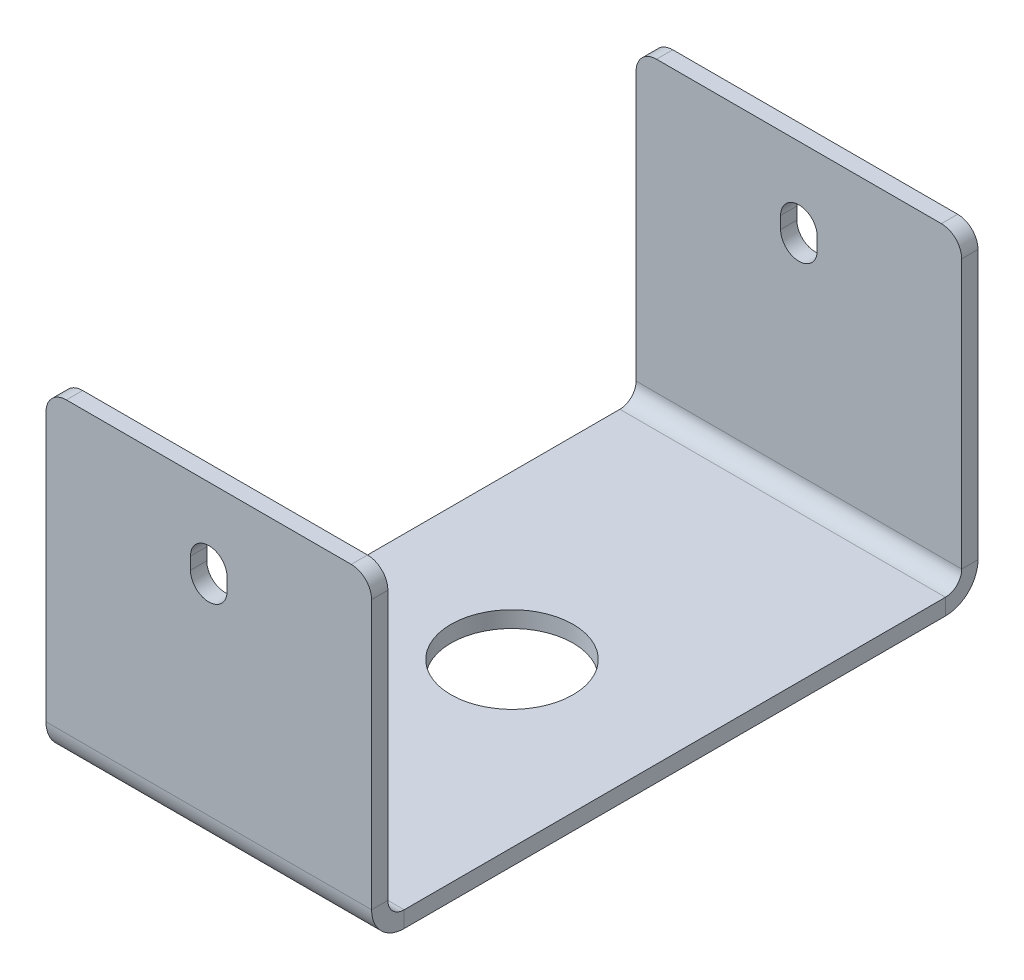
ISO-10303-21;
HEADER;
FILE_DESCRIPTION(('STEP AP214'),'2;1');
FILE_NAME('part.step','',(''),(''),'','','');
FILE_SCHEMA(('AUTOMOTIVE_DESIGN { 1 0 10303 214 1 1 1 1 }'));
ENDSEC;
DATA;
#1=APPLICATION_CONTEXT('core data for automotive mechanical design processes');
#2=APPLICATION_PROTOCOL_DEFINITION('international standard','automotive_design',2000,#1);
#3=PRODUCT_CONTEXT('',#1,'mechanical');
#4=PRODUCT('Part','Part','',(#3));
#5=PRODUCT_RELATED_PRODUCT_CATEGORY('part','',(#4));
#6=PRODUCT_DEFINITION_FORMATION('','',#4);
#7=PRODUCT_DEFINITION_CONTEXT('part definition',#1,'design');
#8=PRODUCT_DEFINITION('design','',#6,#7);
#9=PRODUCT_DEFINITION_SHAPE('','',#8);
#10=(LENGTH_UNIT() NAMED_UNIT(*) SI_UNIT(.MILLI.,.METRE.));
#11=(NAMED_UNIT(*) PLANE_ANGLE_UNIT() SI_UNIT($,.RADIAN.));
#12=(NAMED_UNIT(*) SI_UNIT($,.STERADIAN.) SOLID_ANGLE_UNIT());
#13=UNCERTAINTY_MEASURE_WITH_UNIT(LENGTH_MEASURE(1.E-05),#10,'distance_accuracy_value','');
#14=(GEOMETRIC_REPRESENTATION_CONTEXT(3) GLOBAL_UNCERTAINTY_ASSIGNED_CONTEXT((#13)) GLOBAL_UNIT_ASSIGNED_CONTEXT((#10,
#11,#12)) REPRESENTATION_CONTEXT('',''));
#15=CARTESIAN_POINT('',(0.,0.,0.));
#16=DIRECTION('',(0.,0.,1.));
#17=DIRECTION('',(1.,0.,0.));
#18=AXIS2_PLACEMENT_3D('',#15,#16,#17);
#19=CARTESIAN_POINT('',(40.,0.,66.5));
#20=DIRECTION('',(1.,0.,0.));
#21=DIRECTION('',(0.,0.,-1.));
#22=AXIS2_PLACEMENT_3D('',#19,#20,#21);
#23=PLANE('',#22);
#24=DIRECTION('',(0.,-1.,0.));
#25=VECTOR('',#24,1.);
#26=CARTESIAN_POINT('',(40.,0.,66.5));
#27=LINE('',#26,#25);
#28=CARTESIAN_POINT('',(40.,0.,66.5));
#29=VERTEX_POINT('',#28);
#30=CARTESIAN_POINT('',(40.,-4.,66.5));
#31=VERTEX_POINT('',#30);
#32=EDGE_CURVE('E382',#29,#31,#27,.T.);
#33=ORIENTED_EDGE('',*,*,#32,.F.);
#34=CARTESIAN_POINT('',(40.,4.,66.5));
#35=DIRECTION('',(-1.,0.,0.));
#36=DIRECTION('',(0.,0.,1.));
#37=AXIS2_PLACEMENT_3D('',#34,#35,#36);
#38=CIRCLE('',#37,4.);
#39=CARTESIAN_POINT('',(40.,4.,70.5));
#40=VERTEX_POINT('',#39);
#41=EDGE_CURVE('E289',#40,#29,#38,.F.);
#42=ORIENTED_EDGE('',*,*,#41,.F.);
#43=DIRECTION('',(0.,0.,-1.));
#44=VECTOR('',#43,1.);
#45=CARTESIAN_POINT('',(40.,4.00000000000001,74.5));
#46=LINE('',#45,#44);
#47=CARTESIAN_POINT('',(40.,4.00000000000001,74.5));
#48=VERTEX_POINT('',#47);
#49=EDGE_CURVE('E379',#48,#40,#46,.T.);
#50=ORIENTED_EDGE('',*,*,#49,.F.);
#51=CARTESIAN_POINT('',(40.,4.,66.5));
#52=DIRECTION('',(1.,0.,0.));
#53=DIRECTION('',(0.,0.,-1.));
#54=AXIS2_PLACEMENT_3D('',#51,#52,#53);
#55=CIRCLE('',#54,8.);
#56=EDGE_CURVE('E296',#48,#31,#55,.T.);
#57=ORIENTED_EDGE('',*,*,#56,.T.);
#58=EDGE_LOOP('',(#33,#42,#50,#57));
#59=FACE_BOUND('',#58,.T.);
#60=ADVANCED_FACE('F39',(#59),#23,.T.);
#61=CARTESIAN_POINT('',(40.,4.00000000000001,74.5));
#62=DIRECTION('',(1.,0.,0.));
#63=DIRECTION('',(0.,0.,-1.));
#64=AXIS2_PLACEMENT_3D('',#61,#62,#63);
#65=PLANE('',#64);
#66=DIRECTION('',(0.,0.,-1.));
#67=VECTOR('',#66,1.);
#68=CARTESIAN_POINT('',(40.,0.,70.5));
#69=LINE('',#68,#67);
#70=CARTESIAN_POINT('',(40.,0.,-66.5));
#71=VERTEX_POINT('',#70);
#72=EDGE_CURVE('E286',#29,#71,#69,.T.);
#73=ORIENTED_EDGE('',*,*,#72,.F.);
#74=ORIENTED_EDGE('',*,*,#32,.T.);
#75=DIRECTION('',(0.,0.,-1.));
#76=VECTOR('',#75,1.);
#77=CARTESIAN_POINT('',(40.,-4.,70.5));
#78=LINE('',#77,#76);
#79=CARTESIAN_POINT('',(40.,-4.,-66.5));
#80=VERTEX_POINT('',#79);
#81=EDGE_CURVE('E299',#31,#80,#78,.T.);
#82=ORIENTED_EDGE('',*,*,#81,.T.);
#83=DIRECTION('',(0.,1.,0.));
#84=VECTOR('',#83,1.);
#85=CARTESIAN_POINT('',(40.,-4.,-66.5));
#86=LINE('',#85,#84);
#87=EDGE_CURVE('E370',#80,#71,#86,.T.);
#88=ORIENTED_EDGE('',*,*,#87,.T.);
#89=EDGE_LOOP('',(#73,#74,#82,#88));
#90=FACE_BOUND('',#89,.T.);
#91=ADVANCED_FACE('F442',(#90),#65,.T.);
#92=CARTESIAN_POINT('',(-40.,4.,70.5));
#93=DIRECTION('',(-1.,0.,0.));
#94=DIRECTION('',(0.,0.,1.));
#95=AXIS2_PLACEMENT_3D('',#92,#93,#94);
#96=PLANE('',#95);
#97=DIRECTION('',(0.,0.,1.));
#98=VECTOR('',#97,1.);
#99=CARTESIAN_POINT('',(-40.,4.,70.5));
#100=LINE('',#99,#98);
#101=CARTESIAN_POINT('',(-40.,4.,70.5));
#102=VERTEX_POINT('',#101);
#103=CARTESIAN_POINT('',(-40.,4.00000000000001,74.5));
#104=VERTEX_POINT('',#103);
#105=EDGE_CURVE('E376',#102,#104,#100,.T.);
#106=ORIENTED_EDGE('',*,*,#105,.F.);
#107=CARTESIAN_POINT('',(-40.,4.,66.5));
#108=DIRECTION('',(-1.,0.,0.));
#109=DIRECTION('',(0.,0.,1.));
#110=AXIS2_PLACEMENT_3D('',#107,#108,#109);
#111=CIRCLE('',#110,4.);
#112=CARTESIAN_POINT('',(-40.,0.,66.5));
#113=VERTEX_POINT('',#112);
#114=EDGE_CURVE('E317',#102,#113,#111,.F.);
#115=ORIENTED_EDGE('',*,*,#114,.T.);
#116=DIRECTION('',(0.,1.,0.));
#117=VECTOR('',#116,1.);
#118=CARTESIAN_POINT('',(-40.,-4.,66.5));
#119=LINE('',#118,#117);
#120=CARTESIAN_POINT('',(-40.,-4.,66.5));
#121=VERTEX_POINT('',#120);
#122=EDGE_CURVE('E374',#121,#113,#119,.T.);
#123=ORIENTED_EDGE('',*,*,#122,.F.);
#124=CARTESIAN_POINT('',(-40.,4.,66.5));
#125=DIRECTION('',(1.,0.,0.));
#126=DIRECTION('',(0.,0.,-1.));
#127=AXIS2_PLACEMENT_3D('',#124,#125,#126);
#128=CIRCLE('',#127,8.);
#129=EDGE_CURVE('E324',#104,#121,#128,.T.);
#130=ORIENTED_EDGE('',*,*,#129,.F.);
#131=EDGE_LOOP('',(#106,#115,#123,#130));
#132=FACE_BOUND('',#131,.T.);
#133=ADVANCED_FACE('F499',(#132),#96,.T.);
#134=CARTESIAN_POINT('',(-40.,-4.,66.5));
#135=DIRECTION('',(-1.,0.,0.));
#136=DIRECTION('',(0.,0.,1.));
#137=AXIS2_PLACEMENT_3D('',#134,#135,#136);
#138=PLANE('',#137);
#139=DIRECTION('',(0.,-1.,0.));
#140=VECTOR('',#139,1.);
#141=CARTESIAN_POINT('',(-40.,75.,74.5));
#142=LINE('',#141,#140);
#143=CARTESIAN_POINT('',(-40.,70.,74.5));
#144=VERTEX_POINT('',#143);
#145=EDGE_CURVE('E322',#144,#104,#142,.T.);
#146=ORIENTED_EDGE('',*,*,#145,.F.);
#147=DIRECTION('',(0.,0.,-1.));
#148=VECTOR('',#147,1.);
#149=CARTESIAN_POINT('',(-40.,70.,66.5));
#150=LINE('',#149,#148);
#151=CARTESIAN_POINT('',(-40.,70.,70.5));
#152=VERTEX_POINT('',#151);
#153=EDGE_CURVE('E11',#144,#152,#150,.T.);
#154=ORIENTED_EDGE('',*,*,#153,.T.);
#155=DIRECTION('',(0.,-1.,0.));
#156=VECTOR('',#155,1.);
#157=CARTESIAN_POINT('',(-40.,75.,70.5));
#158=LINE('',#157,#156);
#159=EDGE_CURVE('E320',#152,#102,#158,.T.);
#160=ORIENTED_EDGE('',*,*,#159,.T.);
#161=ORIENTED_EDGE('',*,*,#105,.T.);
#162=EDGE_LOOP('',(#146,#154,#160,#161));
#163=FACE_BOUND('',#162,.T.);
#164=ADVANCED_FACE('F515',(#163),#138,.T.);
#165=CARTESIAN_POINT('',(40.,4.,-70.5));
#166=DIRECTION('',(1.,0.,0.));
#167=DIRECTION('',(0.,0.,-1.));
#168=AXIS2_PLACEMENT_3D('',#165,#166,#167);
#169=PLANE('',#168);
#170=DIRECTION('',(0.,0.,-1.));
#171=VECTOR('',#170,1.);
#172=CARTESIAN_POINT('',(40.,4.,-70.5));
#173=LINE('',#172,#171);
#174=CARTESIAN_POINT('',(40.,4.,-70.5));
#175=VERTEX_POINT('',#174);
#176=CARTESIAN_POINT('',(40.,4.,-74.5));
#177=VERTEX_POINT('',#176);
#178=EDGE_CURVE('E372',#175,#177,#173,.T.);
#179=ORIENTED_EDGE('',*,*,#178,.F.);
#180=CARTESIAN_POINT('',(40.,4.,-66.5));
#181=DIRECTION('',(-1.,0.,0.));
#182=DIRECTION('',(0.,0.,1.));
#183=AXIS2_PLACEMENT_3D('',#180,#181,#182);
#184=CIRCLE('',#183,4.);
#185=EDGE_CURVE('E283',#71,#175,#184,.F.);
#186=ORIENTED_EDGE('',*,*,#185,.F.);
#187=ORIENTED_EDGE('',*,*,#87,.F.);
#188=CARTESIAN_POINT('',(40.,4.,-66.5));
#189=DIRECTION('',(1.,0.,0.));
#190=DIRECTION('',(0.,0.,-1.));
#191=AXIS2_PLACEMENT_3D('',#188,#189,#190);
#192=CIRCLE('',#191,8.);
#193=EDGE_CURVE('E302',#80,#177,#192,.T.);
#194=ORIENTED_EDGE('',*,*,#193,.T.);
#195=EDGE_LOOP('',(#179,#186,#187,#194));
#196=FACE_BOUND('',#195,.T.);
#197=ADVANCED_FACE('F451',(#196),#169,.T.);
#198=CARTESIAN_POINT('',(40.,-4.,-66.5));
#199=DIRECTION('',(1.,0.,0.));
#200=DIRECTION('',(0.,0.,-1.));
#201=AXIS2_PLACEMENT_3D('',#198,#199,#200);
#202=PLANE('',#201);
#203=DIRECTION('',(0.,1.,0.));
#204=VECTOR('',#203,1.);
#205=CARTESIAN_POINT('',(40.,0.,-74.5));
#206=LINE('',#205,#204);
#207=CARTESIAN_POINT('',(40.,70.,-74.5));
#208=VERTEX_POINT('',#207);
#209=EDGE_CURVE('E276',#177,#208,#206,.T.);
#210=ORIENTED_EDGE('',*,*,#209,.T.);
#211=DIRECTION('',(0.,0.,-1.));
#212=VECTOR('',#211,1.);
#213=CARTESIAN_POINT('',(40.,70.,-66.5));
#214=LINE('',#213,#212);
#215=CARTESIAN_POINT('',(40.,70.,-70.5));
#216=VERTEX_POINT('',#215);
#217=EDGE_CURVE('E400',#208,#216,#214,.F.);
#218=ORIENTED_EDGE('',*,*,#217,.T.);
#219=DIRECTION('',(0.,1.,0.));
#220=VECTOR('',#219,1.);
#221=CARTESIAN_POINT('',(40.,0.,-70.5));
#222=LINE('',#221,#220);
#223=EDGE_CURVE('E279',#175,#216,#222,.T.);
#224=ORIENTED_EDGE('',*,*,#223,.F.);
#225=ORIENTED_EDGE('',*,*,#178,.T.);
#226=EDGE_LOOP('',(#210,#218,#224,#225));
#227=FACE_BOUND('',#226,.T.);
#228=ADVANCED_FACE('F461',(#227),#202,.T.);
#229=CARTESIAN_POINT('',(-40.,0.,-66.5));
#230=DIRECTION('',(-1.,0.,0.));
#231=DIRECTION('',(0.,0.,1.));
#232=AXIS2_PLACEMENT_3D('',#229,#230,#231);
#233=PLANE('',#232);
#234=DIRECTION('',(0.,-1.,0.));
#235=VECTOR('',#234,1.);
#236=CARTESIAN_POINT('',(-40.,0.,-66.5));
#237=LINE('',#236,#235);
#238=CARTESIAN_POINT('',(-40.,0.,-66.5));
#239=VERTEX_POINT('',#238);
#240=CARTESIAN_POINT('',(-40.,-4.,-66.5));
#241=VERTEX_POINT('',#240);
#242=EDGE_CURVE('E368',#239,#241,#237,.T.);
#243=ORIENTED_EDGE('',*,*,#242,.F.);
#244=CARTESIAN_POINT('',(-40.,4.,-66.5));
#245=DIRECTION('',(-1.,0.,0.));
#246=DIRECTION('',(0.,0.,1.));
#247=AXIS2_PLACEMENT_3D('',#244,#245,#246);
#248=CIRCLE('',#247,4.);
#249=CARTESIAN_POINT('',(-40.,4.,-70.5));
#250=VERTEX_POINT('',#249);
#251=EDGE_CURVE('E311',#239,#250,#248,.F.);
#252=ORIENTED_EDGE('',*,*,#251,.T.);
#253=DIRECTION('',(0.,0.,1.));
#254=VECTOR('',#253,1.);
#255=CARTESIAN_POINT('',(-40.,4.,-74.5));
#256=LINE('',#255,#254);
#257=CARTESIAN_POINT('',(-40.,4.,-74.5));
#258=VERTEX_POINT('',#257);
#259=EDGE_CURVE('E366',#258,#250,#256,.T.);
#260=ORIENTED_EDGE('',*,*,#259,.F.);
#261=CARTESIAN_POINT('',(-40.,4.,-66.5));
#262=DIRECTION('',(1.,0.,0.));
#263=DIRECTION('',(0.,0.,-1.));
#264=AXIS2_PLACEMENT_3D('',#261,#262,#263);
#265=CIRCLE('',#264,8.);
#266=EDGE_CURVE('E280',#241,#258,#265,.T.);
#267=ORIENTED_EDGE('',*,*,#266,.F.);
#268=EDGE_LOOP('',(#243,#252,#260,#267));
#269=FACE_BOUND('',#268,.T.);
#270=ADVANCED_FACE('F481',(#269),#233,.T.);
#271=CARTESIAN_POINT('',(-40.,4.,-74.5));
#272=DIRECTION('',(-1.,0.,0.));
#273=DIRECTION('',(0.,0.,1.));
#274=AXIS2_PLACEMENT_3D('',#271,#272,#273);
#275=PLANE('',#274);
#276=DIRECTION('',(0.,0.,-1.));
#277=VECTOR('',#276,1.);
#278=CARTESIAN_POINT('',(-40.,0.,70.5));
#279=LINE('',#278,#277);
#280=EDGE_CURVE('E314',#113,#239,#279,.T.);
#281=ORIENTED_EDGE('',*,*,#280,.T.);
#282=ORIENTED_EDGE('',*,*,#242,.T.);
#283=DIRECTION('',(0.,0.,-1.));
#284=VECTOR('',#283,1.);
#285=CARTESIAN_POINT('',(-40.,-4.,70.5));
#286=LINE('',#285,#284);
#287=EDGE_CURVE('E327',#121,#241,#286,.T.);
#288=ORIENTED_EDGE('',*,*,#287,.F.);
#289=ORIENTED_EDGE('',*,*,#122,.T.);
#290=EDGE_LOOP('',(#281,#282,#288,#289));
#291=FACE_BOUND('',#290,.T.);
#292=ADVANCED_FACE('F485',(#291),#275,.T.);
#293=CARTESIAN_POINT('',(40.,0.,-74.5));
#294=DIRECTION('',(0.,0.,1.));
#295=DIRECTION('',(0.,-1.,0.));
#296=AXIS2_PLACEMENT_3D('',#293,#294,#295);
#297=PLANE('',#296);
#298=DIRECTION('',(0.,1.,0.));
#299=VECTOR('',#298,1.);
#300=CARTESIAN_POINT('',(4.5,57.,-74.5));
#301=LINE('',#300,#299);
#302=CARTESIAN_POINT('',(4.5,54.,-74.5));
#303=VERTEX_POINT('',#302);
#304=CARTESIAN_POINT('',(4.5,57.,-74.5));
#305=VERTEX_POINT('',#304);
#306=EDGE_CURVE('E229',#303,#305,#301,.T.);
#307=ORIENTED_EDGE('',*,*,#306,.T.);
#308=CARTESIAN_POINT('',(0.,57.,-74.5));
#309=DIRECTION('',(0.,0.,1.));
#310=DIRECTION('',(1.,0.,0.));
#311=AXIS2_PLACEMENT_3D('',#308,#309,#310);
#312=CIRCLE('',#311,4.5);
#313=CARTESIAN_POINT('',(-4.5,57.,-74.5));
#314=VERTEX_POINT('',#313);
#315=EDGE_CURVE('E207',#305,#314,#312,.T.);
#316=ORIENTED_EDGE('',*,*,#315,.T.);
#317=DIRECTION('',(0.,-1.,0.));
#318=VECTOR('',#317,1.);
#319=CARTESIAN_POINT('',(-4.5,57.,-74.5));
#320=LINE('',#319,#318);
#321=CARTESIAN_POINT('',(-4.5,54.,-74.5));
#322=VERTEX_POINT('',#321);
#323=EDGE_CURVE('E218',#314,#322,#320,.T.);
#324=ORIENTED_EDGE('',*,*,#323,.T.);
#325=CARTESIAN_POINT('',(0.,54.,-74.5));
#326=DIRECTION('',(0.,0.,1.));
#327=DIRECTION('',(1.,0.,0.));
#328=AXIS2_PLACEMENT_3D('',#325,#326,#327);
#329=CIRCLE('',#328,4.5);
#330=EDGE_CURVE('E224',#322,#303,#329,.T.);
#331=ORIENTED_EDGE('',*,*,#330,.T.);
#332=EDGE_LOOP('',(#307,#316,#324,#331));
#333=FACE_BOUND('',#332,.T.);
#334=DIRECTION('',(0.,1.,0.));
#335=VECTOR('',#334,1.);
#336=CARTESIAN_POINT('',(-40.,0.,-74.5));
#337=LINE('',#336,#335);
#338=CARTESIAN_POINT('',(-40.,70.,-74.5));
#339=VERTEX_POINT('',#338);
#340=EDGE_CURVE('E273',#258,#339,#337,.T.);
#341=ORIENTED_EDGE('',*,*,#340,.T.);
#342=CARTESIAN_POINT('',(-35.,70.,-74.5));
#343=DIRECTION('',(0.,0.,1.));
#344=DIRECTION('',(0.,-1.,0.));
#345=AXIS2_PLACEMENT_3D('',#342,#343,#344);
#346=CIRCLE('',#345,5.);
#347=CARTESIAN_POINT('',(-35.,75.,-74.5));
#348=VERTEX_POINT('',#347);
#349=EDGE_CURVE('E389',#339,#348,#346,.F.);
#350=ORIENTED_EDGE('',*,*,#349,.T.);
#351=DIRECTION('',(-1.,0.,0.));
#352=VECTOR('',#351,1.);
#353=CARTESIAN_POINT('',(40.,75.,-74.5));
#354=LINE('',#353,#352);
#355=CARTESIAN_POINT('',(35.,75.,-74.5));
#356=VERTEX_POINT('',#355);
#357=EDGE_CURVE('E363',#356,#348,#354,.T.);
#358=ORIENTED_EDGE('',*,*,#357,.F.);
#359=CARTESIAN_POINT('',(35.,70.,-74.5));
#360=DIRECTION('',(0.,0.,1.));
#361=DIRECTION('',(0.,-1.,0.));
#362=AXIS2_PLACEMENT_3D('',#359,#360,#361);
#363=CIRCLE('',#362,5.);
#364=EDGE_CURVE('E387',#356,#208,#363,.F.);
#365=ORIENTED_EDGE('',*,*,#364,.T.);
#366=ORIENTED_EDGE('',*,*,#209,.F.);
#367=DIRECTION('',(-1.,0.,0.));
#368=VECTOR('',#367,1.);
#369=CARTESIAN_POINT('',(40.,4.,-74.5));
#370=LINE('',#369,#368);
#371=EDGE_CURVE('E305',#177,#258,#370,.T.);
#372=ORIENTED_EDGE('',*,*,#371,.T.);
#373=EDGE_LOOP('',(#341,#350,#358,#365,#366,#372));
#374=FACE_BOUND('',#373,.T.);
#375=ADVANCED_FACE('F226',(#333,#374),#297,.F.);
#376=CARTESIAN_POINT('',(40.,75.,-70.5));
#377=DIRECTION('',(0.,1.,0.));
#378=DIRECTION('',(0.,0.,1.));
#379=AXIS2_PLACEMENT_3D('',#376,#377,#378);
#380=PLANE('',#379);
#381=ORIENTED_EDGE('',*,*,#357,.T.);
#382=DIRECTION('',(0.,0.,-1.));
#383=VECTOR('',#382,1.);
#384=CARTESIAN_POINT('',(-35.,75.,-70.5));
#385=LINE('',#384,#383);
#386=CARTESIAN_POINT('',(-35.,75.,-70.5));
#387=VERTEX_POINT('',#386);
#388=EDGE_CURVE('E394',#348,#387,#385,.F.);
#389=ORIENTED_EDGE('',*,*,#388,.T.);
#390=DIRECTION('',(-1.,0.,0.));
#391=VECTOR('',#390,1.);
#392=CARTESIAN_POINT('',(40.,75.,-70.5));
#393=LINE('',#392,#391);
#394=CARTESIAN_POINT('',(35.,75.,-70.5));
#395=VERTEX_POINT('',#394);
#396=EDGE_CURVE('E360',#395,#387,#393,.T.);
#397=ORIENTED_EDGE('',*,*,#396,.F.);
#398=DIRECTION('',(0.,0.,-1.));
#399=VECTOR('',#398,1.);
#400=CARTESIAN_POINT('',(35.,75.,-70.5));
#401=LINE('',#400,#399);
#402=EDGE_CURVE('E391',#395,#356,#401,.T.);
#403=ORIENTED_EDGE('',*,*,#402,.T.);
#404=EDGE_LOOP('',(#381,#389,#397,#403));
#405=FACE_BOUND('',#404,.T.);
#406=ADVANCED_FACE('F470',(#405),#380,.T.);
#407=CARTESIAN_POINT('',(40.,0.,-70.5));
#408=DIRECTION('',(0.,0.,1.));
#409=DIRECTION('',(0.,-1.,0.));
#410=AXIS2_PLACEMENT_3D('',#407,#408,#409);
#411=PLANE('',#410);
#412=CARTESIAN_POINT('',(0.,57.,-70.5));
#413=DIRECTION('',(0.,0.,1.));
#414=DIRECTION('',(0.,-1.,0.));
#415=AXIS2_PLACEMENT_3D('',#412,#413,#414);
#416=CIRCLE('',#415,4.5);
#417=CARTESIAN_POINT('',(4.5,57.,-70.5));
#418=VERTEX_POINT('',#417);
#419=CARTESIAN_POINT('',(-4.5,57.,-70.5));
#420=VERTEX_POINT('',#419);
#421=EDGE_CURVE('E210',#418,#420,#416,.T.);
#422=ORIENTED_EDGE('',*,*,#421,.F.);
#423=DIRECTION('',(0.,1.,0.));
#424=VECTOR('',#423,1.);
#425=CARTESIAN_POINT('',(4.5,0.,-70.5));
#426=LINE('',#425,#424);
#427=CARTESIAN_POINT('',(4.5,54.,-70.5));
#428=VERTEX_POINT('',#427);
#429=EDGE_CURVE('E264',#428,#418,#426,.T.);
#430=ORIENTED_EDGE('',*,*,#429,.F.);
#431=CARTESIAN_POINT('',(0.,54.,-70.5));
#432=DIRECTION('',(0.,0.,1.));
#433=DIRECTION('',(0.,-1.,0.));
#434=AXIS2_PLACEMENT_3D('',#431,#432,#433);
#435=CIRCLE('',#434,4.5);
#436=CARTESIAN_POINT('',(-4.5,54.,-70.5));
#437=VERTEX_POINT('',#436);
#438=EDGE_CURVE('E260',#437,#428,#435,.T.);
#439=ORIENTED_EDGE('',*,*,#438,.F.);
#440=DIRECTION('',(0.,-1.,0.));
#441=VECTOR('',#440,1.);
#442=CARTESIAN_POINT('',(-4.5,0.,-70.5));
#443=LINE('',#442,#441);
#444=EDGE_CURVE('E255',#420,#437,#443,.T.);
#445=ORIENTED_EDGE('',*,*,#444,.F.);
#446=EDGE_LOOP('',(#422,#430,#439,#445));
#447=FACE_BOUND('',#446,.T.);
#448=ORIENTED_EDGE('',*,*,#396,.T.);
#449=CARTESIAN_POINT('',(-35.,70.,-70.5));
#450=DIRECTION('',(0.,0.,1.));
#451=DIRECTION('',(0.,-1.,0.));
#452=AXIS2_PLACEMENT_3D('',#449,#450,#451);
#453=CIRCLE('',#452,5.);
#454=CARTESIAN_POINT('',(-40.,70.,-70.5));
#455=VERTEX_POINT('',#454);
#456=EDGE_CURVE('E398',#387,#455,#453,.T.);
#457=ORIENTED_EDGE('',*,*,#456,.T.);
#458=DIRECTION('',(0.,1.,0.));
#459=VECTOR('',#458,1.);
#460=CARTESIAN_POINT('',(-40.,0.,-70.5));
#461=LINE('',#460,#459);
#462=EDGE_CURVE('E308',#250,#455,#461,.T.);
#463=ORIENTED_EDGE('',*,*,#462,.F.);
#464=DIRECTION('',(-1.,0.,0.));
#465=VECTOR('',#464,1.);
#466=CARTESIAN_POINT('',(40.,4.,-70.5));
#467=LINE('',#466,#465);
#468=EDGE_CURVE('E357',#175,#250,#467,.T.);
#469=ORIENTED_EDGE('',*,*,#468,.F.);
#470=ORIENTED_EDGE('',*,*,#223,.T.);
#471=CARTESIAN_POINT('',(35.,70.,-70.5));
#472=DIRECTION('',(0.,0.,1.));
#473=DIRECTION('',(0.,-1.,0.));
#474=AXIS2_PLACEMENT_3D('',#471,#472,#473);
#475=CIRCLE('',#474,5.);
#476=EDGE_CURVE('E396',#216,#395,#475,.T.);
#477=ORIENTED_EDGE('',*,*,#476,.T.);
#478=EDGE_LOOP('',(#448,#457,#463,#469,#470,#477));
#479=FACE_BOUND('',#478,.T.);
#480=ADVANCED_FACE('F459',(#447,#479),#411,.T.);
#481=CARTESIAN_POINT('',(40.,4.,-66.5));
#482=DIRECTION('',(-1.,0.,0.));
#483=DIRECTION('',(0.,0.,1.));
#484=AXIS2_PLACEMENT_3D('',#481,#482,#483);
#485=CYLINDRICAL_SURFACE('',#484,4.);
#486=ORIENTED_EDGE('',*,*,#251,.F.);
#487=DIRECTION('',(-1.,0.,0.));
#488=VECTOR('',#487,1.);
#489=CARTESIAN_POINT('',(40.,0.,-66.5));
#490=LINE('',#489,#488);
#491=EDGE_CURVE('E354',#71,#239,#490,.T.);
#492=ORIENTED_EDGE('',*,*,#491,.F.);
#493=ORIENTED_EDGE('',*,*,#185,.T.);
#494=ORIENTED_EDGE('',*,*,#468,.T.);
#495=EDGE_LOOP('',(#486,#492,#493,#494));
#496=FACE_BOUND('',#495,.T.);
#497=ADVANCED_FACE('F450',(#496),#485,.F.);
#498=CARTESIAN_POINT('',(40.,0.,70.5));
#499=DIRECTION('',(0.,1.,0.));
#500=DIRECTION('',(0.,0.,1.));
#501=AXIS2_PLACEMENT_3D('',#498,#499,#500);
#502=PLANE('',#501);
#503=CARTESIAN_POINT('',(0.,0.,0.));
#504=DIRECTION('',(0.,1.,0.));
#505=DIRECTION('',(0.,0.,1.));
#506=AXIS2_PLACEMENT_3D('',#503,#504,#505);
#507=CIRCLE('',#506,15.);
#508=CARTESIAN_POINT('',(0.,0.,15.));
#509=VERTEX_POINT('',#508);
#510=EDGE_CURVE('E269',#509,#509,#507,.F.);
#511=ORIENTED_EDGE('',*,*,#510,.T.);
#512=EDGE_LOOP('',(#511));
#513=FACE_BOUND('',#512,.T.);
#514=ORIENTED_EDGE('',*,*,#280,.F.);
#515=DIRECTION('',(-1.,0.,0.));
#516=VECTOR('',#515,1.);
#517=CARTESIAN_POINT('',(40.,0.,66.5));
#518=LINE('',#517,#516);
#519=EDGE_CURVE('E351',#29,#113,#518,.T.);
#520=ORIENTED_EDGE('',*,*,#519,.F.);
#521=ORIENTED_EDGE('',*,*,#72,.T.);
#522=ORIENTED_EDGE('',*,*,#491,.T.);
#523=EDGE_LOOP('',(#514,#520,#521,#522));
#524=FACE_BOUND('',#523,.T.);
#525=ADVANCED_FACE('F441',(#513,#524),#502,.T.);
#526=CARTESIAN_POINT('',(40.,4.,66.5));
#527=DIRECTION('',(-1.,0.,0.));
#528=DIRECTION('',(0.,0.,1.));
#529=AXIS2_PLACEMENT_3D('',#526,#527,#528);
#530=CYLINDRICAL_SURFACE('',#529,4.);
#531=ORIENTED_EDGE('',*,*,#114,.F.);
#532=DIRECTION('',(-1.,0.,0.));
#533=VECTOR('',#532,1.);
#534=CARTESIAN_POINT('',(40.,4.,70.5));
#535=LINE('',#534,#533);
#536=EDGE_CURVE('E348',#40,#102,#535,.T.);
#537=ORIENTED_EDGE('',*,*,#536,.F.);
#538=ORIENTED_EDGE('',*,*,#41,.T.);
#539=ORIENTED_EDGE('',*,*,#519,.T.);
#540=EDGE_LOOP('',(#531,#537,#538,#539));
#541=FACE_BOUND('',#540,.T.);
#542=ADVANCED_FACE('F432',(#541),#530,.F.);
#543=CARTESIAN_POINT('',(40.,75.,70.5));
#544=DIRECTION('',(0.,0.,-1.));
#545=DIRECTION('',(0.,1.,0.));
#546=AXIS2_PLACEMENT_3D('',#543,#544,#545);
#547=PLANE('',#546);
#548=CARTESIAN_POINT('',(0.,57.,70.5));
#549=DIRECTION('',(0.,0.,-1.));
#550=DIRECTION('',(0.,1.,0.));
#551=AXIS2_PLACEMENT_3D('',#548,#549,#550);
#552=CIRCLE('',#551,4.5);
#553=CARTESIAN_POINT('',(-4.5,57.,70.5));
#554=VERTEX_POINT('',#553);
#555=CARTESIAN_POINT('',(4.5,57.,70.5));
#556=VERTEX_POINT('',#555);
#557=EDGE_CURVE('E266',#554,#556,#552,.T.);
#558=ORIENTED_EDGE('',*,*,#557,.F.);
#559=DIRECTION('',(0.,1.,0.));
#560=VECTOR('',#559,1.);
#561=CARTESIAN_POINT('',(-4.5,75.,70.5));
#562=LINE('',#561,#560);
#563=CARTESIAN_POINT('',(-4.5,54.,70.5));
#564=VERTEX_POINT('',#563);
#565=EDGE_CURVE('E247',#564,#554,#562,.T.);
#566=ORIENTED_EDGE('',*,*,#565,.F.);
#567=CARTESIAN_POINT('',(0.,54.,70.5));
#568=DIRECTION('',(0.,0.,-1.));
#569=DIRECTION('',(0.,1.,0.));
#570=AXIS2_PLACEMENT_3D('',#567,#568,#569);
#571=CIRCLE('',#570,4.5);
#572=CARTESIAN_POINT('',(4.5,54.,70.5));
#573=VERTEX_POINT('',#572);
#574=EDGE_CURVE('E257',#573,#564,#571,.T.);
#575=ORIENTED_EDGE('',*,*,#574,.F.);
#576=DIRECTION('',(0.,-1.,0.));
#577=VECTOR('',#576,1.);
#578=CARTESIAN_POINT('',(4.5,75.,70.5));
#579=LINE('',#578,#577);
#580=EDGE_CURVE('E262',#556,#573,#579,.T.);
#581=ORIENTED_EDGE('',*,*,#580,.F.);
#582=EDGE_LOOP('',(#558,#566,#575,#581));
#583=FACE_BOUND('',#582,.T.);
#584=DIRECTION('',(-1.,0.,0.));
#585=VECTOR('',#584,1.);
#586=CARTESIAN_POINT('',(40.,75.,70.5));
#587=LINE('',#586,#585);
#588=CARTESIAN_POINT('',(35.,75.,70.5));
#589=VERTEX_POINT('',#588);
#590=CARTESIAN_POINT('',(-35.,75.,70.5));
#591=VERTEX_POINT('',#590);
#592=EDGE_CURVE('E345',#589,#591,#587,.T.);
#593=ORIENTED_EDGE('',*,*,#592,.F.);
#594=CARTESIAN_POINT('',(35.,70.,70.5));
#595=DIRECTION('',(0.,0.,-1.));
#596=DIRECTION('',(0.,1.,0.));
#597=AXIS2_PLACEMENT_3D('',#594,#595,#596);
#598=CIRCLE('',#597,5.);
#599=CARTESIAN_POINT('',(40.,70.,70.5));
#600=VERTEX_POINT('',#599);
#601=EDGE_CURVE('E409',#589,#600,#598,.T.);
#602=ORIENTED_EDGE('',*,*,#601,.T.);
#603=DIRECTION('',(0.,-1.,0.));
#604=VECTOR('',#603,1.);
#605=CARTESIAN_POINT('',(40.,75.,70.5));
#606=LINE('',#605,#604);
#607=EDGE_CURVE('E292',#600,#40,#606,.T.);
#608=ORIENTED_EDGE('',*,*,#607,.T.);
#609=ORIENTED_EDGE('',*,*,#536,.T.);
#610=ORIENTED_EDGE('',*,*,#159,.F.);
#611=CARTESIAN_POINT('',(-35.,70.,70.5));
#612=DIRECTION('',(0.,0.,-1.));
#613=DIRECTION('',(0.,1.,0.));
#614=AXIS2_PLACEMENT_3D('',#611,#612,#613);
#615=CIRCLE('',#614,5.);
#616=EDGE_CURVE('E407',#152,#591,#615,.T.);
#617=ORIENTED_EDGE('',*,*,#616,.T.);
#618=EDGE_LOOP('',(#593,#602,#608,#609,#610,#617));
#619=FACE_BOUND('',#618,.T.);
#620=ADVANCED_FACE('F424',(#583,#619),#547,.T.);
#621=CARTESIAN_POINT('',(40.,75.,74.5));
#622=DIRECTION('',(0.,1.,0.));
#623=DIRECTION('',(0.,0.,1.));
#624=AXIS2_PLACEMENT_3D('',#621,#622,#623);
#625=PLANE('',#624);
#626=DIRECTION('',(-1.,0.,0.));
#627=VECTOR('',#626,1.);
#628=CARTESIAN_POINT('',(40.,75.,74.5));
#629=LINE('',#628,#627);
#630=CARTESIAN_POINT('',(35.,75.,74.5));
#631=VERTEX_POINT('',#630);
#632=CARTESIAN_POINT('',(-35.,75.,74.5));
#633=VERTEX_POINT('',#632);
#634=EDGE_CURVE('E343',#631,#633,#629,.T.);
#635=ORIENTED_EDGE('',*,*,#634,.F.);
#636=DIRECTION('',(0.,0.,-1.));
#637=VECTOR('',#636,1.);
#638=CARTESIAN_POINT('',(35.,75.,70.5));
#639=LINE('',#638,#637);
#640=EDGE_CURVE('E404',#631,#589,#639,.T.);
#641=ORIENTED_EDGE('',*,*,#640,.T.);
#642=ORIENTED_EDGE('',*,*,#592,.T.);
#643=DIRECTION('',(0.,0.,-1.));
#644=VECTOR('',#643,1.);
#645=CARTESIAN_POINT('',(-35.,75.,74.5));
#646=LINE('',#645,#644);
#647=EDGE_CURVE('E402',#591,#633,#646,.F.);
#648=ORIENTED_EDGE('',*,*,#647,.T.);
#649=EDGE_LOOP('',(#635,#641,#642,#648));
#650=FACE_BOUND('',#649,.T.);
#651=ADVANCED_FACE('F419',(#650),#625,.T.);
#652=CARTESIAN_POINT('',(40.,75.,74.5));
#653=DIRECTION('',(0.,0.,-1.));
#654=DIRECTION('',(0.,1.,0.));
#655=AXIS2_PLACEMENT_3D('',#652,#653,#654);
#656=PLANE('',#655);
#657=DIRECTION('',(0.,-1.,0.));
#658=VECTOR('',#657,1.);
#659=CARTESIAN_POINT('',(-4.5,57.,74.5));
#660=LINE('',#659,#658);
#661=CARTESIAN_POINT('',(-4.5,57.,74.5));
#662=VERTEX_POINT('',#661);
#663=CARTESIAN_POINT('',(-4.5,54.,74.5));
#664=VERTEX_POINT('',#663);
#665=EDGE_CURVE('E240',#662,#664,#660,.T.);
#666=ORIENTED_EDGE('',*,*,#665,.F.);
#667=CARTESIAN_POINT('',(0.,57.,74.5));
#668=DIRECTION('',(0.,0.,1.));
#669=DIRECTION('',(1.,0.,0.));
#670=AXIS2_PLACEMENT_3D('',#667,#668,#669);
#671=CIRCLE('',#670,4.5);
#672=CARTESIAN_POINT('',(4.5,57.,74.5));
#673=VERTEX_POINT('',#672);
#674=EDGE_CURVE('E238',#673,#662,#671,.T.);
#675=ORIENTED_EDGE('',*,*,#674,.F.);
#676=DIRECTION('',(0.,1.,0.));
#677=VECTOR('',#676,1.);
#678=CARTESIAN_POINT('',(4.5,57.,74.5));
#679=LINE('',#678,#677);
#680=CARTESIAN_POINT('',(4.5,54.,74.5));
#681=VERTEX_POINT('',#680);
#682=EDGE_CURVE('E230',#681,#673,#679,.T.);
#683=ORIENTED_EDGE('',*,*,#682,.F.);
#684=CARTESIAN_POINT('',(0.,54.,74.5));
#685=DIRECTION('',(0.,0.,1.));
#686=DIRECTION('',(1.,0.,0.));
#687=AXIS2_PLACEMENT_3D('',#684,#685,#686);
#688=CIRCLE('',#687,4.5);
#689=EDGE_CURVE('E233',#664,#681,#688,.T.);
#690=ORIENTED_EDGE('',*,*,#689,.F.);
#691=EDGE_LOOP('',(#666,#675,#683,#690));
#692=FACE_BOUND('',#691,.T.);
#693=DIRECTION('',(0.,-1.,0.));
#694=VECTOR('',#693,1.);
#695=CARTESIAN_POINT('',(40.,75.,74.5));
#696=LINE('',#695,#694);
#697=CARTESIAN_POINT('',(40.,70.,74.5));
#698=VERTEX_POINT('',#697);
#699=EDGE_CURVE('E294',#698,#48,#696,.T.);
#700=ORIENTED_EDGE('',*,*,#699,.F.);
#701=CARTESIAN_POINT('',(35.,70.,74.5));
#702=DIRECTION('',(0.,0.,-1.));
#703=DIRECTION('',(0.,1.,0.));
#704=AXIS2_PLACEMENT_3D('',#701,#702,#703);
#705=CIRCLE('',#704,5.);
#706=EDGE_CURVE('E47',#698,#631,#705,.F.);
#707=ORIENTED_EDGE('',*,*,#706,.T.);
#708=ORIENTED_EDGE('',*,*,#634,.T.);
#709=CARTESIAN_POINT('',(-35.,70.,74.5));
#710=DIRECTION('',(0.,0.,-1.));
#711=DIRECTION('',(0.,1.,0.));
#712=AXIS2_PLACEMENT_3D('',#709,#710,#711);
#713=CIRCLE('',#712,5.);
#714=EDGE_CURVE('E54',#633,#144,#713,.F.);
#715=ORIENTED_EDGE('',*,*,#714,.T.);
#716=ORIENTED_EDGE('',*,*,#145,.T.);
#717=DIRECTION('',(-1.,0.,0.));
#718=VECTOR('',#717,1.);
#719=CARTESIAN_POINT('',(40.,4.00000000000001,74.5));
#720=LINE('',#719,#718);
#721=EDGE_CURVE('E340',#48,#104,#720,.T.);
#722=ORIENTED_EDGE('',*,*,#721,.F.);
#723=EDGE_LOOP('',(#700,#707,#708,#715,#716,#722));
#724=FACE_BOUND('',#723,.T.);
#725=ADVANCED_FACE('F414',(#692,#724),#656,.F.);
#726=CARTESIAN_POINT('',(40.,4.,66.5));
#727=DIRECTION('',(-1.,0.,0.));
#728=DIRECTION('',(0.,0.,1.));
#729=AXIS2_PLACEMENT_3D('',#726,#727,#728);
#730=CYLINDRICAL_SURFACE('',#729,8.);
#731=ORIENTED_EDGE('',*,*,#129,.T.);
#732=DIRECTION('',(-1.,0.,0.));
#733=VECTOR('',#732,1.);
#734=CARTESIAN_POINT('',(40.,-4.,66.5));
#735=LINE('',#734,#733);
#736=EDGE_CURVE('E337',#31,#121,#735,.T.);
#737=ORIENTED_EDGE('',*,*,#736,.F.);
#738=ORIENTED_EDGE('',*,*,#56,.F.);
#739=ORIENTED_EDGE('',*,*,#721,.T.);
#740=EDGE_LOOP('',(#731,#737,#738,#739));
#741=FACE_BOUND('',#740,.T.);
#742=ADVANCED_FACE('F519',(#741),#730,.T.);
#743=CARTESIAN_POINT('',(40.,-4.,70.5));
#744=DIRECTION('',(0.,1.,0.));
#745=DIRECTION('',(0.,0.,1.));
#746=AXIS2_PLACEMENT_3D('',#743,#744,#745);
#747=PLANE('',#746);
#748=CARTESIAN_POINT('',(0.,-4.,0.));
#749=DIRECTION('',(0.,-1.,0.));
#750=DIRECTION('',(0.,0.,-1.));
#751=AXIS2_PLACEMENT_3D('',#748,#749,#750);
#752=CIRCLE('',#751,15.);
#753=CARTESIAN_POINT('',(0.,-4.,-15.));
#754=VERTEX_POINT('',#753);
#755=EDGE_CURVE('E270',#754,#754,#752,.T.);
#756=ORIENTED_EDGE('',*,*,#755,.F.);
#757=EDGE_LOOP('',(#756));
#758=FACE_BOUND('',#757,.T.);
#759=ORIENTED_EDGE('',*,*,#287,.T.);
#760=DIRECTION('',(-1.,0.,0.));
#761=VECTOR('',#760,1.);
#762=CARTESIAN_POINT('',(40.,-4.,-66.5));
#763=LINE('',#762,#761);
#764=EDGE_CURVE('E334',#80,#241,#763,.T.);
#765=ORIENTED_EDGE('',*,*,#764,.F.);
#766=ORIENTED_EDGE('',*,*,#81,.F.);
#767=ORIENTED_EDGE('',*,*,#736,.T.);
#768=EDGE_LOOP('',(#759,#765,#766,#767));
#769=FACE_BOUND('',#768,.T.);
#770=ADVANCED_FACE('F522',(#758,#769),#747,.F.);
#771=CARTESIAN_POINT('',(40.,4.,-66.5));
#772=DIRECTION('',(-1.,0.,0.));
#773=DIRECTION('',(0.,0.,1.));
#774=AXIS2_PLACEMENT_3D('',#771,#772,#773);
#775=CYLINDRICAL_SURFACE('',#774,8.);
#776=ORIENTED_EDGE('',*,*,#266,.T.);
#777=ORIENTED_EDGE('',*,*,#371,.F.);
#778=ORIENTED_EDGE('',*,*,#193,.F.);
#779=ORIENTED_EDGE('',*,*,#764,.T.);
#780=EDGE_LOOP('',(#776,#777,#778,#779));
#781=FACE_BOUND('',#780,.T.);
#782=ADVANCED_FACE('F483',(#781),#775,.T.);
#783=CARTESIAN_POINT('',(40.,4.,-66.5));
#784=DIRECTION('',(-1.,0.,0.));
#785=DIRECTION('',(0.,0.,1.));
#786=AXIS2_PLACEMENT_3D('',#783,#784,#785);
#787=PLANE('',#786);
#788=ORIENTED_EDGE('',*,*,#607,.F.);
#789=DIRECTION('',(0.,0.,-1.));
#790=VECTOR('',#789,1.);
#791=CARTESIAN_POINT('',(40.,70.,74.5));
#792=LINE('',#791,#790);
#793=EDGE_CURVE('E62',#600,#698,#792,.F.);
#794=ORIENTED_EDGE('',*,*,#793,.T.);
#795=ORIENTED_EDGE('',*,*,#699,.T.);
#796=ORIENTED_EDGE('',*,*,#49,.T.);
#797=EDGE_LOOP('',(#788,#794,#795,#796));
#798=FACE_BOUND('',#797,.T.);
#799=ADVANCED_FACE('F425',(#798),#787,.F.);
#800=CARTESIAN_POINT('',(-40.,4.,-66.5));
#801=DIRECTION('',(-1.,0.,0.));
#802=DIRECTION('',(0.,0.,1.));
#803=AXIS2_PLACEMENT_3D('',#800,#801,#802);
#804=PLANE('',#803);
#805=ORIENTED_EDGE('',*,*,#462,.T.);
#806=DIRECTION('',(0.,0.,-1.));
#807=VECTOR('',#806,1.);
#808=CARTESIAN_POINT('',(-40.,70.,-66.5));
#809=LINE('',#808,#807);
#810=EDGE_CURVE('E384',#455,#339,#809,.T.);
#811=ORIENTED_EDGE('',*,*,#810,.T.);
#812=ORIENTED_EDGE('',*,*,#340,.F.);
#813=ORIENTED_EDGE('',*,*,#259,.T.);
#814=EDGE_LOOP('',(#805,#811,#812,#813));
#815=FACE_BOUND('',#814,.T.);
#816=ADVANCED_FACE('F477',(#815),#804,.T.);
#817=CARTESIAN_POINT('',(0.,75.001,0.));
#818=DIRECTION('',(0.,-1.,0.));
#819=DIRECTION('',(0.,0.,-1.));
#820=AXIS2_PLACEMENT_3D('',#817,#818,#819);
#821=CYLINDRICAL_SURFACE('',#820,15.);
#822=ORIENTED_EDGE('',*,*,#510,.F.);
#823=EDGE_LOOP('',(#822));
#824=FACE_BOUND('',#823,.T.);
#825=ORIENTED_EDGE('',*,*,#755,.T.);
#826=EDGE_LOOP('',(#825));
#827=FACE_BOUND('',#826,.T.);
#828=ADVANCED_FACE('F615',(#824,#827),#821,.F.);
#829=CARTESIAN_POINT('',(-4.5,57.,-74.5));
#830=DIRECTION('',(-1.,0.,0.));
#831=DIRECTION('',(0.,0.,1.));
#832=AXIS2_PLACEMENT_3D('',#829,#830,#831);
#833=PLANE('',#832);
#834=ORIENTED_EDGE('',*,*,#565,.T.);
#835=DIRECTION('',(0.,0.,1.));
#836=VECTOR('',#835,1.);
#837=CARTESIAN_POINT('',(-4.5,57.,-74.5));
#838=LINE('',#837,#836);
#839=EDGE_CURVE('E214',#554,#662,#838,.T.);
#840=ORIENTED_EDGE('',*,*,#839,.T.);
#841=ORIENTED_EDGE('',*,*,#665,.T.);
#842=DIRECTION('',(0.,0.,1.));
#843=VECTOR('',#842,1.);
#844=CARTESIAN_POINT('',(-4.5,54.,-74.5));
#845=LINE('',#844,#843);
#846=EDGE_CURVE('E213',#564,#664,#845,.T.);
#847=ORIENTED_EDGE('',*,*,#846,.F.);
#848=EDGE_LOOP('',(#834,#840,#841,#847));
#849=FACE_BOUND('',#848,.T.);
#850=ADVANCED_FACE('F620',(#849),#833,.F.);
#851=CARTESIAN_POINT('',(0.,54.,-74.5));
#852=DIRECTION('',(0.,0.,1.));
#853=DIRECTION('',(1.,0.,0.));
#854=AXIS2_PLACEMENT_3D('',#851,#852,#853);
#855=CYLINDRICAL_SURFACE('',#854,4.5);
#856=ORIENTED_EDGE('',*,*,#574,.T.);
#857=ORIENTED_EDGE('',*,*,#846,.T.);
#858=ORIENTED_EDGE('',*,*,#689,.T.);
#859=DIRECTION('',(0.,0.,1.));
#860=VECTOR('',#859,1.);
#861=CARTESIAN_POINT('',(4.5,54.,-74.5));
#862=LINE('',#861,#860);
#863=EDGE_CURVE('E252',#573,#681,#862,.T.);
#864=ORIENTED_EDGE('',*,*,#863,.F.);
#865=EDGE_LOOP('',(#856,#857,#858,#864));
#866=FACE_BOUND('',#865,.T.);
#867=ADVANCED_FACE('F632',(#866),#855,.F.);
#868=CARTESIAN_POINT('',(4.5,57.,-74.5));
#869=DIRECTION('',(1.,0.,0.));
#870=DIRECTION('',(0.,0.,-1.));
#871=AXIS2_PLACEMENT_3D('',#868,#869,#870);
#872=PLANE('',#871);
#873=ORIENTED_EDGE('',*,*,#580,.T.);
#874=ORIENTED_EDGE('',*,*,#863,.T.);
#875=ORIENTED_EDGE('',*,*,#682,.T.);
#876=DIRECTION('',(0.,0.,1.));
#877=VECTOR('',#876,1.);
#878=CARTESIAN_POINT('',(4.5,57.,-74.5));
#879=LINE('',#878,#877);
#880=EDGE_CURVE('E248',#556,#673,#879,.T.);
#881=ORIENTED_EDGE('',*,*,#880,.F.);
#882=EDGE_LOOP('',(#873,#874,#875,#881));
#883=FACE_BOUND('',#882,.T.);
#884=ADVANCED_FACE('F642',(#883),#872,.F.);
#885=CARTESIAN_POINT('',(0.,57.,-74.5));
#886=DIRECTION('',(0.,0.,1.));
#887=DIRECTION('',(1.,0.,0.));
#888=AXIS2_PLACEMENT_3D('',#885,#886,#887);
#889=CYLINDRICAL_SURFACE('',#888,4.5);
#890=ORIENTED_EDGE('',*,*,#557,.T.);
#891=ORIENTED_EDGE('',*,*,#880,.T.);
#892=ORIENTED_EDGE('',*,*,#674,.T.);
#893=ORIENTED_EDGE('',*,*,#839,.F.);
#894=EDGE_LOOP('',(#890,#891,#892,#893));
#895=FACE_BOUND('',#894,.T.);
#896=ADVANCED_FACE('F653',(#895),#889,.F.);
#897=ORIENTED_EDGE('',*,*,#421,.T.);
#898=EDGE_CURVE('E202',#314,#420,#838,.T.);
#899=ORIENTED_EDGE('',*,*,#898,.F.);
#900=ORIENTED_EDGE('',*,*,#315,.F.);
#901=EDGE_CURVE('E245',#305,#418,#879,.T.);
#902=ORIENTED_EDGE('',*,*,#901,.T.);
#903=EDGE_LOOP('',(#897,#899,#900,#902));
#904=FACE_BOUND('',#903,.T.);
#905=ADVANCED_FACE('F204',(#904),#889,.F.);
#906=ORIENTED_EDGE('',*,*,#429,.T.);
#907=ORIENTED_EDGE('',*,*,#901,.F.);
#908=ORIENTED_EDGE('',*,*,#306,.F.);
#909=EDGE_CURVE('E249',#303,#428,#862,.T.);
#910=ORIENTED_EDGE('',*,*,#909,.T.);
#911=EDGE_LOOP('',(#906,#907,#908,#910));
#912=FACE_BOUND('',#911,.T.);
#913=ADVANCED_FACE('F656',(#912),#872,.F.);
#914=ORIENTED_EDGE('',*,*,#438,.T.);
#915=ORIENTED_EDGE('',*,*,#909,.F.);
#916=ORIENTED_EDGE('',*,*,#330,.F.);
#917=EDGE_CURVE('E221',#322,#437,#845,.T.);
#918=ORIENTED_EDGE('',*,*,#917,.T.);
#919=EDGE_LOOP('',(#914,#915,#916,#918));
#920=FACE_BOUND('',#919,.T.);
#921=ADVANCED_FACE('F645',(#920),#855,.F.);
#922=ORIENTED_EDGE('',*,*,#444,.T.);
#923=ORIENTED_EDGE('',*,*,#917,.F.);
#924=ORIENTED_EDGE('',*,*,#323,.F.);
#925=ORIENTED_EDGE('',*,*,#898,.T.);
#926=EDGE_LOOP('',(#922,#923,#924,#925));
#927=FACE_BOUND('',#926,.T.);
#928=ADVANCED_FACE('F219',(#927),#833,.F.);
#929=CARTESIAN_POINT('',(-35.,70.,-66.5));
#930=DIRECTION('',(0.,0.,-1.));
#931=DIRECTION('',(-1.,0.,0.));
#932=AXIS2_PLACEMENT_3D('',#929,#930,#931);
#933=CYLINDRICAL_SURFACE('',#932,5.);
#934=ORIENTED_EDGE('',*,*,#456,.F.);
#935=ORIENTED_EDGE('',*,*,#388,.F.);
#936=ORIENTED_EDGE('',*,*,#349,.F.);
#937=ORIENTED_EDGE('',*,*,#810,.F.);
#938=EDGE_LOOP('',(#934,#935,#936,#937));
#939=FACE_BOUND('',#938,.T.);
#940=ADVANCED_FACE('F474',(#939),#933,.T.);
#941=CARTESIAN_POINT('',(35.,70.,-70.5));
#942=DIRECTION('',(0.,0.,-1.));
#943=DIRECTION('',(-1.,0.,0.));
#944=AXIS2_PLACEMENT_3D('',#941,#942,#943);
#945=CYLINDRICAL_SURFACE('',#944,5.);
#946=ORIENTED_EDGE('',*,*,#476,.F.);
#947=ORIENTED_EDGE('',*,*,#217,.F.);
#948=ORIENTED_EDGE('',*,*,#364,.F.);
#949=ORIENTED_EDGE('',*,*,#402,.F.);
#950=EDGE_LOOP('',(#946,#947,#948,#949));
#951=FACE_BOUND('',#950,.T.);
#952=ADVANCED_FACE('F465',(#951),#945,.T.);
#953=CARTESIAN_POINT('',(35.,70.,74.5));
#954=DIRECTION('',(0.,0.,1.));
#955=DIRECTION('',(1.,0.,0.));
#956=AXIS2_PLACEMENT_3D('',#953,#954,#955);
#957=CYLINDRICAL_SURFACE('',#956,5.);
#958=ORIENTED_EDGE('',*,*,#706,.F.);
#959=ORIENTED_EDGE('',*,*,#793,.F.);
#960=ORIENTED_EDGE('',*,*,#601,.F.);
#961=ORIENTED_EDGE('',*,*,#640,.F.);
#962=EDGE_LOOP('',(#958,#959,#960,#961));
#963=FACE_BOUND('',#962,.T.);
#964=ADVANCED_FACE('F422',(#963),#957,.T.);
#965=CARTESIAN_POINT('',(-35.,70.,66.5));
#966=DIRECTION('',(0.,0.,-1.));
#967=DIRECTION('',(-1.,0.,0.));
#968=AXIS2_PLACEMENT_3D('',#965,#966,#967);
#969=CYLINDRICAL_SURFACE('',#968,5.);
#970=ORIENTED_EDGE('',*,*,#714,.F.);
#971=ORIENTED_EDGE('',*,*,#647,.F.);
#972=ORIENTED_EDGE('',*,*,#616,.F.);
#973=ORIENTED_EDGE('',*,*,#153,.F.);
#974=EDGE_LOOP('',(#970,#971,#972,#973));
#975=FACE_BOUND('',#974,.T.);
#976=ADVANCED_FACE('F41',(#975),#969,.T.);
#977=CLOSED_SHELL('',(#60,#91,#133,#164,#197,#228,#270,#292,#375,#406,#480,#497,#525,#542,#620,
#651,#725,#742,#770,#782,#799,#816,#828,#850,#867,#884,#896,#905,#913,#921,#928,#940,#952,#964,#976));
#978=MANIFOLD_SOLID_BREP('B2',#977);
#979=ADVANCED_BREP_SHAPE_REPRESENTATION('',(#18,#978),#14);
#980=SHAPE_DEFINITION_REPRESENTATION(#9,#979);
ENDSEC;
END-ISO-10303-21;
